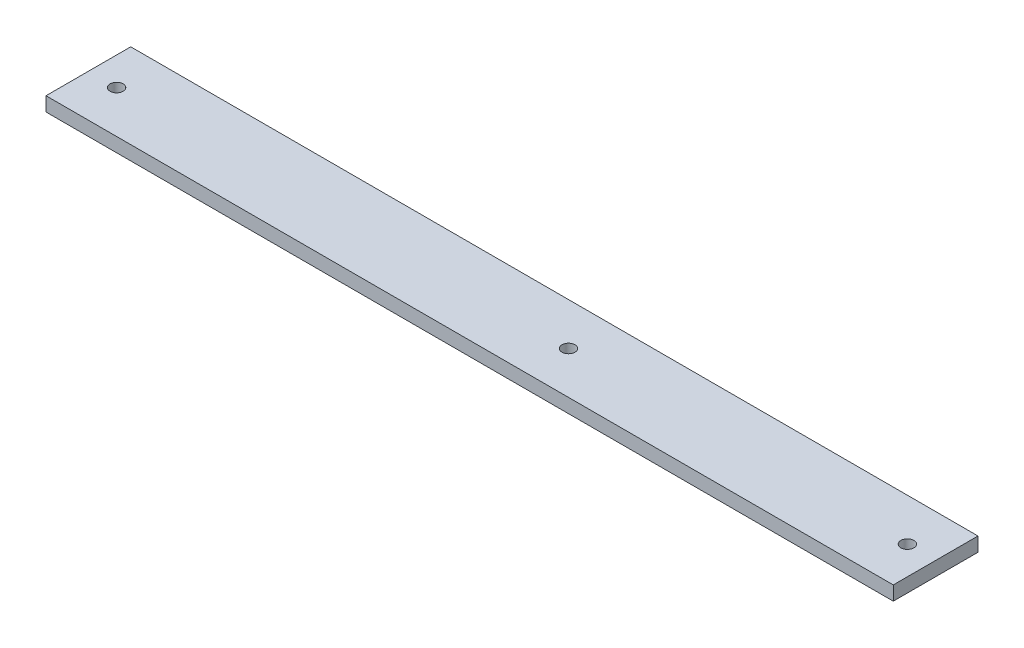
ISO-10303-21;
HEADER;
FILE_DESCRIPTION(('STEP AP214'),'2;1');
FILE_NAME('part.step','',(''),(''),'','','');
FILE_SCHEMA(('AUTOMOTIVE_DESIGN { 1 0 10303 214 1 1 1 1 }'));
ENDSEC;
DATA;
#1=APPLICATION_CONTEXT('core data for automotive mechanical design processes');
#2=APPLICATION_PROTOCOL_DEFINITION('international standard','automotive_design',2000,#1);
#3=PRODUCT_CONTEXT('',#1,'mechanical');
#4=PRODUCT('Part','Part','',(#3));
#5=PRODUCT_RELATED_PRODUCT_CATEGORY('part','',(#4));
#6=PRODUCT_DEFINITION_FORMATION('','',#4);
#7=PRODUCT_DEFINITION_CONTEXT('part definition',#1,'design');
#8=PRODUCT_DEFINITION('design','',#6,#7);
#9=PRODUCT_DEFINITION_SHAPE('','',#8);
#10=(LENGTH_UNIT() NAMED_UNIT(*) SI_UNIT(.MILLI.,.METRE.));
#11=(NAMED_UNIT(*) PLANE_ANGLE_UNIT() SI_UNIT($,.RADIAN.));
#12=(NAMED_UNIT(*) SI_UNIT($,.STERADIAN.) SOLID_ANGLE_UNIT());
#13=UNCERTAINTY_MEASURE_WITH_UNIT(LENGTH_MEASURE(1.E-05),#10,'distance_accuracy_value','');
#14=(GEOMETRIC_REPRESENTATION_CONTEXT(3) GLOBAL_UNCERTAINTY_ASSIGNED_CONTEXT((#13)) GLOBAL_UNIT_ASSIGNED_CONTEXT((#10,
#11,#12)) REPRESENTATION_CONTEXT('',''));
#15=CARTESIAN_POINT('',(0.,0.,0.));
#16=DIRECTION('',(0.,0.,1.));
#17=DIRECTION('',(1.,0.,0.));
#18=AXIS2_PLACEMENT_3D('',#15,#16,#17);
#19=CARTESIAN_POINT('',(0.,3.175,0.));
#20=DIRECTION('',(0.,-1.,0.));
#21=DIRECTION('',(0.,0.,-1.));
#22=AXIS2_PLACEMENT_3D('',#19,#20,#21);
#23=PLANE('',#22);
#24=DIRECTION('',(0.,0.,1.));
#25=VECTOR('',#24,1.);
#26=CARTESIAN_POINT('',(0.,3.175,0.));
#27=LINE('',#26,#25);
#28=CARTESIAN_POINT('',(0.,3.175,-19.05));
#29=VERTEX_POINT('',#28);
#30=CARTESIAN_POINT('',(0.,3.175,0.));
#31=VERTEX_POINT('',#30);
#32=EDGE_CURVE('E91',#29,#31,#27,.T.);
#33=ORIENTED_EDGE('',*,*,#32,.T.);
#34=DIRECTION('',(1.,0.,0.));
#35=VECTOR('',#34,1.);
#36=CARTESIAN_POINT('',(0.,3.175,0.));
#37=LINE('',#36,#35);
#38=CARTESIAN_POINT('',(190.5,3.175,0.));
#39=VERTEX_POINT('',#38);
#40=EDGE_CURVE('E86',#31,#39,#37,.T.);
#41=ORIENTED_EDGE('',*,*,#40,.T.);
#42=DIRECTION('',(0.,0.,-1.));
#43=VECTOR('',#42,1.);
#44=CARTESIAN_POINT('',(190.5,3.175,0.));
#45=LINE('',#44,#43);
#46=CARTESIAN_POINT('',(190.5,3.175,-19.05));
#47=VERTEX_POINT('',#46);
#48=EDGE_CURVE('E89',#39,#47,#45,.T.);
#49=ORIENTED_EDGE('',*,*,#48,.T.);
#50=DIRECTION('',(-1.,0.,0.));
#51=VECTOR('',#50,1.);
#52=CARTESIAN_POINT('',(0.,3.175,-19.05));
#53=LINE('',#52,#51);
#54=EDGE_CURVE('E56',#47,#29,#53,.T.);
#55=ORIENTED_EDGE('',*,*,#54,.T.);
#56=EDGE_LOOP('',(#33,#41,#49,#55));
#57=FACE_BOUND('',#56,.T.);
#58=CARTESIAN_POINT('',(6.35,3.175,-9.525));
#59=DIRECTION('',(0.,1.,0.));
#60=DIRECTION('',(0.,0.,1.));
#61=AXIS2_PLACEMENT_3D('',#58,#59,#60);
#62=CIRCLE('',#61,1.4605);
#63=CARTESIAN_POINT('',(6.35,3.175,-8.0645));
#64=VERTEX_POINT('',#63);
#65=EDGE_CURVE('E106',#64,#64,#62,.T.);
#66=ORIENTED_EDGE('',*,*,#65,.F.);
#67=EDGE_LOOP('',(#66));
#68=FACE_BOUND('',#67,.T.);
#69=CARTESIAN_POINT('',(184.15,3.175,-9.525));
#70=DIRECTION('',(0.,1.,0.));
#71=DIRECTION('',(0.,0.,1.));
#72=AXIS2_PLACEMENT_3D('',#69,#70,#71);
#73=CIRCLE('',#72,1.4605);
#74=CARTESIAN_POINT('',(184.15,3.175,-8.0645));
#75=VERTEX_POINT('',#74);
#76=EDGE_CURVE('E121',#75,#75,#73,.T.);
#77=ORIENTED_EDGE('',*,*,#76,.F.);
#78=EDGE_LOOP('',(#77));
#79=FACE_BOUND('',#78,.T.);
#80=CARTESIAN_POINT('',(107.95,3.175,-9.525));
#81=DIRECTION('',(0.,1.,0.));
#82=DIRECTION('',(0.,0.,1.));
#83=AXIS2_PLACEMENT_3D('',#80,#81,#82);
#84=CIRCLE('',#83,1.4605);
#85=CARTESIAN_POINT('',(107.95,3.175,-8.0645));
#86=VERTEX_POINT('',#85);
#87=EDGE_CURVE('E127',#86,#86,#84,.T.);
#88=ORIENTED_EDGE('',*,*,#87,.F.);
#89=EDGE_LOOP('',(#88));
#90=FACE_BOUND('',#89,.T.);
#91=ADVANCED_FACE('F39',(#57,#68,#79,#90),#23,.F.);
#92=CARTESIAN_POINT('',(0.,0.,0.));
#93=DIRECTION('',(0.,-1.,0.));
#94=DIRECTION('',(0.,0.,-1.));
#95=AXIS2_PLACEMENT_3D('',#92,#93,#94);
#96=PLANE('',#95);
#97=CARTESIAN_POINT('',(184.15,0.,-9.525));
#98=DIRECTION('',(0.,1.,0.));
#99=DIRECTION('',(0.,0.,1.));
#100=AXIS2_PLACEMENT_3D('',#97,#98,#99);
#101=CIRCLE('',#100,1.4605);
#102=CARTESIAN_POINT('',(184.15,0.,-8.0645));
#103=VERTEX_POINT('',#102);
#104=EDGE_CURVE('E124',#103,#103,#101,.T.);
#105=ORIENTED_EDGE('',*,*,#104,.T.);
#106=EDGE_LOOP('',(#105));
#107=FACE_BOUND('',#106,.T.);
#108=DIRECTION('',(0.,0.,1.));
#109=VECTOR('',#108,1.);
#110=CARTESIAN_POINT('',(0.,0.,0.));
#111=LINE('',#110,#109);
#112=CARTESIAN_POINT('',(0.,0.,-19.05));
#113=VERTEX_POINT('',#112);
#114=CARTESIAN_POINT('',(0.,0.,0.));
#115=VERTEX_POINT('',#114);
#116=EDGE_CURVE('E103',#113,#115,#111,.T.);
#117=ORIENTED_EDGE('',*,*,#116,.F.);
#118=DIRECTION('',(-1.,0.,0.));
#119=VECTOR('',#118,1.);
#120=CARTESIAN_POINT('',(0.,0.,-19.05));
#121=LINE('',#120,#119);
#122=CARTESIAN_POINT('',(190.5,0.,-19.05));
#123=VERTEX_POINT('',#122);
#124=EDGE_CURVE('E79',#123,#113,#121,.T.);
#125=ORIENTED_EDGE('',*,*,#124,.F.);
#126=DIRECTION('',(0.,0.,-1.));
#127=VECTOR('',#126,1.);
#128=CARTESIAN_POINT('',(190.5,0.,0.));
#129=LINE('',#128,#127);
#130=CARTESIAN_POINT('',(190.5,0.,0.));
#131=VERTEX_POINT('',#130);
#132=EDGE_CURVE('E73',#131,#123,#129,.T.);
#133=ORIENTED_EDGE('',*,*,#132,.F.);
#134=DIRECTION('',(1.,0.,0.));
#135=VECTOR('',#134,1.);
#136=CARTESIAN_POINT('',(0.,0.,0.));
#137=LINE('',#136,#135);
#138=EDGE_CURVE('E95',#115,#131,#137,.T.);
#139=ORIENTED_EDGE('',*,*,#138,.F.);
#140=EDGE_LOOP('',(#117,#125,#133,#139));
#141=FACE_BOUND('',#140,.T.);
#142=CARTESIAN_POINT('',(6.35,0.,-9.525));
#143=DIRECTION('',(0.,1.,0.));
#144=DIRECTION('',(0.,0.,1.));
#145=AXIS2_PLACEMENT_3D('',#142,#143,#144);
#146=CIRCLE('',#145,1.4605);
#147=CARTESIAN_POINT('',(6.35,0.,-8.0645));
#148=VERTEX_POINT('',#147);
#149=EDGE_CURVE('E118',#148,#148,#146,.T.);
#150=ORIENTED_EDGE('',*,*,#149,.T.);
#151=EDGE_LOOP('',(#150));
#152=FACE_BOUND('',#151,.T.);
#153=CARTESIAN_POINT('',(107.95,0.,-9.525));
#154=DIRECTION('',(0.,1.,0.));
#155=DIRECTION('',(0.,0.,1.));
#156=AXIS2_PLACEMENT_3D('',#153,#154,#155);
#157=CIRCLE('',#156,1.4605);
#158=CARTESIAN_POINT('',(107.95,0.,-8.0645));
#159=VERTEX_POINT('',#158);
#160=EDGE_CURVE('E130',#159,#159,#157,.T.);
#161=ORIENTED_EDGE('',*,*,#160,.T.);
#162=EDGE_LOOP('',(#161));
#163=FACE_BOUND('',#162,.T.);
#164=ADVANCED_FACE('F114',(#107,#141,#152,#163),#96,.T.);
#165=CARTESIAN_POINT('',(0.,3.175,0.));
#166=DIRECTION('',(1.,0.,0.));
#167=DIRECTION('',(0.,0.,-1.));
#168=AXIS2_PLACEMENT_3D('',#165,#166,#167);
#169=PLANE('',#168);
#170=ORIENTED_EDGE('',*,*,#116,.T.);
#171=DIRECTION('',(0.,-1.,0.));
#172=VECTOR('',#171,1.);
#173=CARTESIAN_POINT('',(0.,3.175,0.));
#174=LINE('',#173,#172);
#175=EDGE_CURVE('E11',#31,#115,#174,.T.);
#176=ORIENTED_EDGE('',*,*,#175,.F.);
#177=ORIENTED_EDGE('',*,*,#32,.F.);
#178=DIRECTION('',(0.,-1.,0.));
#179=VECTOR('',#178,1.);
#180=CARTESIAN_POINT('',(0.,3.175,-19.05));
#181=LINE('',#180,#179);
#182=EDGE_CURVE('E99',#29,#113,#181,.T.);
#183=ORIENTED_EDGE('',*,*,#182,.T.);
#184=EDGE_LOOP('',(#170,#176,#177,#183));
#185=FACE_BOUND('',#184,.T.);
#186=ADVANCED_FACE('F41',(#185),#169,.F.);
#187=CARTESIAN_POINT('',(0.,3.175,0.));
#188=DIRECTION('',(0.,0.,-1.));
#189=DIRECTION('',(-1.,0.,0.));
#190=AXIS2_PLACEMENT_3D('',#187,#188,#189);
#191=PLANE('',#190);
#192=ORIENTED_EDGE('',*,*,#138,.T.);
#193=DIRECTION('',(0.,-1.,0.));
#194=VECTOR('',#193,1.);
#195=CARTESIAN_POINT('',(190.5,3.175,0.));
#196=LINE('',#195,#194);
#197=EDGE_CURVE('E48',#39,#131,#196,.T.);
#198=ORIENTED_EDGE('',*,*,#197,.F.);
#199=ORIENTED_EDGE('',*,*,#40,.F.);
#200=ORIENTED_EDGE('',*,*,#175,.T.);
#201=EDGE_LOOP('',(#192,#198,#199,#200));
#202=FACE_BOUND('',#201,.T.);
#203=ADVANCED_FACE('F94',(#202),#191,.F.);
#204=CARTESIAN_POINT('',(190.5,3.175,0.));
#205=DIRECTION('',(-1.,0.,0.));
#206=DIRECTION('',(0.,0.,1.));
#207=AXIS2_PLACEMENT_3D('',#204,#205,#206);
#208=PLANE('',#207);
#209=ORIENTED_EDGE('',*,*,#132,.T.);
#210=DIRECTION('',(0.,-1.,0.));
#211=VECTOR('',#210,1.);
#212=CARTESIAN_POINT('',(190.5,3.175,-19.05));
#213=LINE('',#212,#211);
#214=EDGE_CURVE('E96',#47,#123,#213,.T.);
#215=ORIENTED_EDGE('',*,*,#214,.F.);
#216=ORIENTED_EDGE('',*,*,#48,.F.);
#217=ORIENTED_EDGE('',*,*,#197,.T.);
#218=EDGE_LOOP('',(#209,#215,#216,#217));
#219=FACE_BOUND('',#218,.T.);
#220=ADVANCED_FACE('F97',(#219),#208,.F.);
#221=CARTESIAN_POINT('',(0.,3.175,-19.05));
#222=DIRECTION('',(0.,0.,1.));
#223=DIRECTION('',(1.,0.,0.));
#224=AXIS2_PLACEMENT_3D('',#221,#222,#223);
#225=PLANE('',#224);
#226=ORIENTED_EDGE('',*,*,#124,.T.);
#227=ORIENTED_EDGE('',*,*,#182,.F.);
#228=ORIENTED_EDGE('',*,*,#54,.F.);
#229=ORIENTED_EDGE('',*,*,#214,.T.);
#230=EDGE_LOOP('',(#226,#227,#228,#229));
#231=FACE_BOUND('',#230,.T.);
#232=ADVANCED_FACE('F111',(#231),#225,.F.);
#233=CARTESIAN_POINT('',(6.35,3.175,-9.525));
#234=DIRECTION('',(0.,-1.,0.));
#235=DIRECTION('',(0.,0.,-1.));
#236=AXIS2_PLACEMENT_3D('',#233,#234,#235);
#237=CYLINDRICAL_SURFACE('',#236,1.4605);
#238=ORIENTED_EDGE('',*,*,#65,.T.);
#239=EDGE_LOOP('',(#238));
#240=FACE_BOUND('',#239,.T.);
#241=ORIENTED_EDGE('',*,*,#149,.F.);
#242=EDGE_LOOP('',(#241));
#243=FACE_BOUND('',#242,.T.);
#244=ADVANCED_FACE('F147',(#240,#243),#237,.F.);
#245=CARTESIAN_POINT('',(184.15,3.175,-9.525));
#246=DIRECTION('',(0.,-1.,0.));
#247=DIRECTION('',(0.,0.,-1.));
#248=AXIS2_PLACEMENT_3D('',#245,#246,#247);
#249=CYLINDRICAL_SURFACE('',#248,1.4605);
#250=ORIENTED_EDGE('',*,*,#76,.T.);
#251=EDGE_LOOP('',(#250));
#252=FACE_BOUND('',#251,.T.);
#253=ORIENTED_EDGE('',*,*,#104,.F.);
#254=EDGE_LOOP('',(#253));
#255=FACE_BOUND('',#254,.T.);
#256=ADVANCED_FACE('F192',(#252,#255),#249,.F.);
#257=CARTESIAN_POINT('',(107.95,3.175,-9.525));
#258=DIRECTION('',(0.,-1.,0.));
#259=DIRECTION('',(0.,0.,-1.));
#260=AXIS2_PLACEMENT_3D('',#257,#258,#259);
#261=CYLINDRICAL_SURFACE('',#260,1.4605);
#262=ORIENTED_EDGE('',*,*,#87,.T.);
#263=EDGE_LOOP('',(#262));
#264=FACE_BOUND('',#263,.T.);
#265=ORIENTED_EDGE('',*,*,#160,.F.);
#266=EDGE_LOOP('',(#265));
#267=FACE_BOUND('',#266,.T.);
#268=ADVANCED_FACE('F136',(#264,#267),#261,.F.);
#269=CLOSED_SHELL('',(#91,#164,#186,#203,#220,#232,#244,#256,#268));
#270=MANIFOLD_SOLID_BREP('B2',#269);
#271=ADVANCED_BREP_SHAPE_REPRESENTATION('',(#18,#270),#14);
#272=SHAPE_DEFINITION_REPRESENTATION(#9,#271);
ENDSEC;
END-ISO-10303-21;
